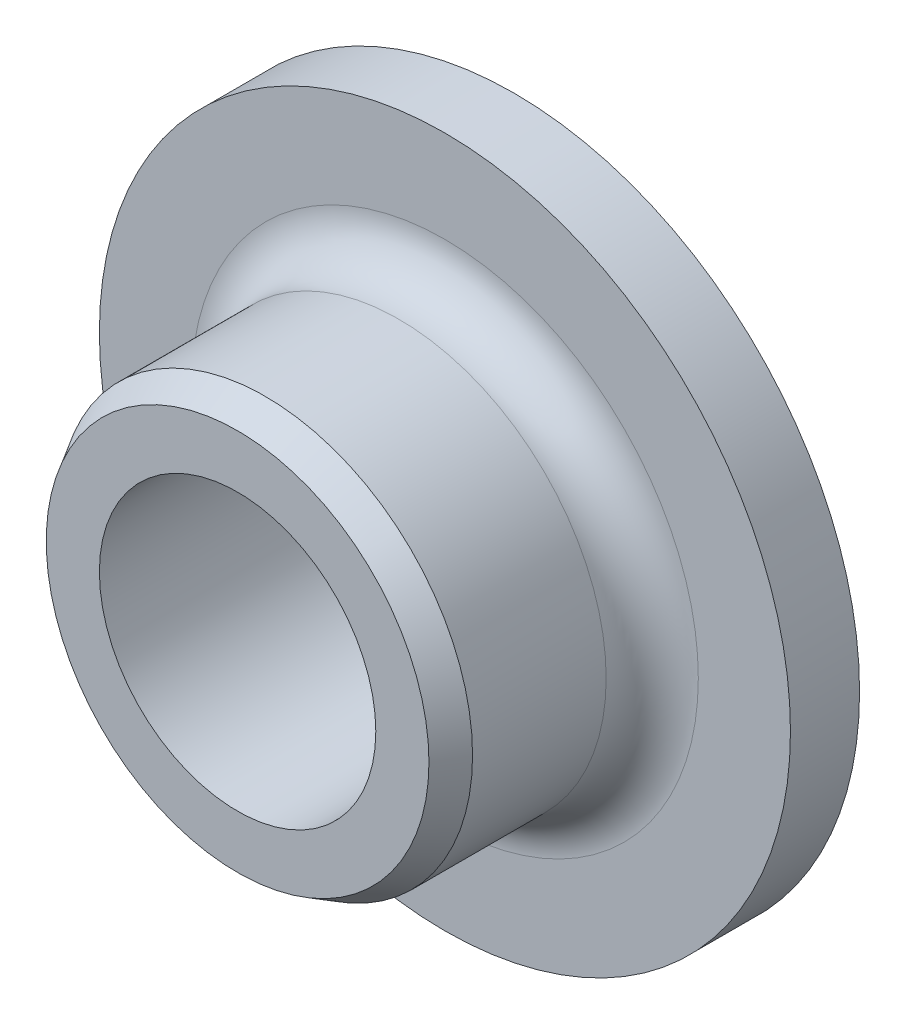
ISO-10303-21;
HEADER;
FILE_DESCRIPTION(('STEP AP214'),'2;1');
FILE_NAME('part.step','',(''),(''),'','','');
FILE_SCHEMA(('AUTOMOTIVE_DESIGN { 1 0 10303 214 1 1 1 1 }'));
ENDSEC;
DATA;
#1=APPLICATION_CONTEXT('core data for automotive mechanical design processes');
#2=APPLICATION_PROTOCOL_DEFINITION('international standard','automotive_design',2000,#1);
#3=PRODUCT_CONTEXT('',#1,'mechanical');
#4=PRODUCT('Part','Part','',(#3));
#5=PRODUCT_RELATED_PRODUCT_CATEGORY('part','',(#4));
#6=PRODUCT_DEFINITION_FORMATION('','',#4);
#7=PRODUCT_DEFINITION_CONTEXT('part definition',#1,'design');
#8=PRODUCT_DEFINITION('design','',#6,#7);
#9=PRODUCT_DEFINITION_SHAPE('','',#8);
#10=(LENGTH_UNIT() NAMED_UNIT(*) SI_UNIT(.MILLI.,.METRE.));
#11=(NAMED_UNIT(*) PLANE_ANGLE_UNIT() SI_UNIT($,.RADIAN.));
#12=(NAMED_UNIT(*) SI_UNIT($,.STERADIAN.) SOLID_ANGLE_UNIT());
#13=UNCERTAINTY_MEASURE_WITH_UNIT(LENGTH_MEASURE(1.E-05),#10,'distance_accuracy_value','');
#14=(GEOMETRIC_REPRESENTATION_CONTEXT(3) GLOBAL_UNCERTAINTY_ASSIGNED_CONTEXT((#13)) GLOBAL_UNIT_ASSIGNED_CONTEXT((#10,
#11,#12)) REPRESENTATION_CONTEXT('',''));
#15=CARTESIAN_POINT('',(0.,0.,0.));
#16=DIRECTION('',(0.,0.,1.));
#17=DIRECTION('',(1.,0.,0.));
#18=AXIS2_PLACEMENT_3D('',#15,#16,#17);
#19=CARTESIAN_POINT('',(0.,0.,1.5));
#20=DIRECTION('',(0.,0.,1.));
#21=DIRECTION('',(-1.,0.,0.));
#22=AXIS2_PLACEMENT_3D('',#19,#20,#21);
#23=CYLINDRICAL_SURFACE('',#22,1.5);
#24=CARTESIAN_POINT('',(0.,0.,0.));
#25=DIRECTION('',(0.,0.,-1.));
#26=DIRECTION('',(1.,0.,0.));
#27=AXIS2_PLACEMENT_3D('',#24,#25,#26);
#28=CIRCLE('',#27,1.5);
#29=CARTESIAN_POINT('',(1.5,0.,0.));
#30=VERTEX_POINT('',#29);
#31=EDGE_CURVE('E55',#30,#30,#28,.F.);
#32=ORIENTED_EDGE('',*,*,#31,.F.);
#33=EDGE_LOOP('',(#32));
#34=FACE_BOUND('',#33,.T.);
#35=CARTESIAN_POINT('',(0.,0.,3.));
#36=DIRECTION('',(0.,0.,1.));
#37=DIRECTION('',(-1.,0.,0.));
#38=AXIS2_PLACEMENT_3D('',#35,#36,#37);
#39=CIRCLE('',#38,1.5);
#40=CARTESIAN_POINT('',(-1.5,0.,3.));
#41=VERTEX_POINT('',#40);
#42=EDGE_CURVE('E51',#41,#41,#39,.T.);
#43=ORIENTED_EDGE('',*,*,#42,.T.);
#44=EDGE_LOOP('',(#43));
#45=FACE_BOUND('',#44,.T.);
#46=ADVANCED_FACE('F17',(#34,#45),#23,.F.);
#47=CARTESIAN_POINT('',(3.75,-3.850334057062,0.));
#48=DIRECTION('',(0.,0.,-1.));
#49=DIRECTION('',(-1.,0.,0.));
#50=AXIS2_PLACEMENT_3D('',#47,#48,#49);
#51=PLANE('',#50);
#52=CARTESIAN_POINT('',(0.,0.,0.));
#53=DIRECTION('',(0.,0.,-1.));
#54=DIRECTION('',(-1.,0.,0.));
#55=AXIS2_PLACEMENT_3D('',#52,#53,#54);
#56=CIRCLE('',#55,3.75);
#57=CARTESIAN_POINT('',(-3.75,0.,0.));
#58=VERTEX_POINT('',#57);
#59=EDGE_CURVE('E47',#58,#58,#56,.F.);
#60=ORIENTED_EDGE('',*,*,#59,.F.);
#61=EDGE_LOOP('',(#60));
#62=FACE_BOUND('',#61,.T.);
#63=ORIENTED_EDGE('',*,*,#31,.T.);
#64=EDGE_LOOP('',(#63));
#65=FACE_BOUND('',#64,.T.);
#66=ADVANCED_FACE('F59',(#62,#65),#51,.T.);
#67=CARTESIAN_POINT('',(-2.0767949192,-2.132361121848,3.));
#68=DIRECTION('',(0.,0.,1.));
#69=DIRECTION('',(1.,0.,0.));
#70=AXIS2_PLACEMENT_3D('',#67,#68,#69);
#71=PLANE('',#70);
#72=CARTESIAN_POINT('',(0.,0.,3.));
#73=DIRECTION('',(0.,0.,1.));
#74=DIRECTION('',(1.,0.,0.));
#75=AXIS2_PLACEMENT_3D('',#72,#73,#74);
#76=CIRCLE('',#75,2.0767949192);
#77=CARTESIAN_POINT('',(2.0767949192,0.,3.));
#78=VERTEX_POINT('',#77);
#79=EDGE_CURVE('E43',#78,#78,#76,.T.);
#80=ORIENTED_EDGE('',*,*,#79,.T.);
#81=EDGE_LOOP('',(#80));
#82=FACE_BOUND('',#81,.T.);
#83=ORIENTED_EDGE('',*,*,#42,.F.);
#84=EDGE_LOOP('',(#83));
#85=FACE_BOUND('',#84,.T.);
#86=ADVANCED_FACE('F66',(#82,#85),#71,.T.);
#87=CARTESIAN_POINT('',(0.,0.,0.375));
#88=DIRECTION('',(0.,0.,1.));
#89=DIRECTION('',(1.,0.,0.));
#90=AXIS2_PLACEMENT_3D('',#87,#88,#89);
#91=CYLINDRICAL_SURFACE('',#90,3.75);
#92=ORIENTED_EDGE('',*,*,#59,.T.);
#93=EDGE_LOOP('',(#92));
#94=FACE_BOUND('',#93,.T.);
#95=CARTESIAN_POINT('',(0.,0.,0.75));
#96=DIRECTION('',(0.,0.,-1.));
#97=DIRECTION('',(-1.,0.,0.));
#98=AXIS2_PLACEMENT_3D('',#95,#96,#97);
#99=CIRCLE('',#98,3.75);
#100=CARTESIAN_POINT('',(-3.75,0.,0.75));
#101=VERTEX_POINT('',#100);
#102=EDGE_CURVE('E38',#101,#101,#99,.F.);
#103=ORIENTED_EDGE('',*,*,#102,.F.);
#104=EDGE_LOOP('',(#103));
#105=FACE_BOUND('',#104,.T.);
#106=ADVANCED_FACE('F68',(#94,#105),#91,.T.);
#107=CARTESIAN_POINT('',(0.,0.,2.7));
#108=DIRECTION('',(0.,0.,-1.));
#109=DIRECTION('',(-1.,0.,0.));
#110=AXIS2_PLACEMENT_3D('',#107,#108,#109);
#111=CONICAL_SURFACE('',#110,2.25,0.523598775706079);
#112=CARTESIAN_POINT('',(0.,0.,2.7));
#113=DIRECTION('',(0.,0.,1.));
#114=DIRECTION('',(1.,0.,0.));
#115=AXIS2_PLACEMENT_3D('',#112,#113,#114);
#116=CIRCLE('',#115,2.25);
#117=CARTESIAN_POINT('',(2.25,0.,2.7));
#118=VERTEX_POINT('',#117);
#119=EDGE_CURVE('E32',#118,#118,#116,.T.);
#120=ORIENTED_EDGE('',*,*,#119,.T.);
#121=EDGE_LOOP('',(#120));
#122=FACE_BOUND('',#121,.T.);
#123=ORIENTED_EDGE('',*,*,#79,.F.);
#124=EDGE_LOOP('',(#123));
#125=FACE_BOUND('',#124,.T.);
#126=ADVANCED_FACE('F76',(#122,#125),#111,.T.);
#127=CARTESIAN_POINT('',(-3.75,-3.850334057062,0.75));
#128=DIRECTION('',(0.,0.,1.));
#129=DIRECTION('',(1.,0.,0.));
#130=AXIS2_PLACEMENT_3D('',#127,#128,#129);
#131=PLANE('',#130);
#132=ORIENTED_EDGE('',*,*,#102,.T.);
#133=EDGE_LOOP('',(#132));
#134=FACE_BOUND('',#133,.T.);
#135=CARTESIAN_POINT('',(0.,0.,0.75));
#136=DIRECTION('',(0.,0.,-1.));
#137=DIRECTION('',(-1.,0.,0.));
#138=AXIS2_PLACEMENT_3D('',#135,#136,#137);
#139=CIRCLE('',#138,2.75);
#140=CARTESIAN_POINT('',(-2.75,0.,0.75));
#141=VERTEX_POINT('',#140);
#142=EDGE_CURVE('E25',#141,#141,#139,.F.);
#143=ORIENTED_EDGE('',*,*,#142,.F.);
#144=EDGE_LOOP('',(#143));
#145=FACE_BOUND('',#144,.T.);
#146=ADVANCED_FACE('F84',(#134,#145),#131,.T.);
#147=CARTESIAN_POINT('',(0.,0.,1.975));
#148=DIRECTION('',(0.,0.,1.));
#149=DIRECTION('',(1.,0.,0.));
#150=AXIS2_PLACEMENT_3D('',#147,#148,#149);
#151=CYLINDRICAL_SURFACE('',#150,2.25);
#152=CARTESIAN_POINT('',(0.,0.,1.25));
#153=DIRECTION('',(0.,0.,1.));
#154=DIRECTION('',(1.,0.,0.));
#155=AXIS2_PLACEMENT_3D('',#152,#153,#154);
#156=CIRCLE('',#155,2.25);
#157=CARTESIAN_POINT('',(2.25,0.,1.25));
#158=VERTEX_POINT('',#157);
#159=EDGE_CURVE('E10',#158,#158,#156,.T.);
#160=ORIENTED_EDGE('',*,*,#159,.T.);
#161=EDGE_LOOP('',(#160));
#162=FACE_BOUND('',#161,.T.);
#163=ORIENTED_EDGE('',*,*,#119,.F.);
#164=EDGE_LOOP('',(#163));
#165=FACE_BOUND('',#164,.T.);
#166=ADVANCED_FACE('F87',(#162,#165),#151,.T.);
#167=CARTESIAN_POINT('',(0.,0.,1.25));
#168=DIRECTION('',(0.,0.,1.));
#169=DIRECTION('',(1.,0.,0.));
#170=AXIS2_PLACEMENT_3D('',#167,#168,#169);
#171=TOROIDAL_SURFACE('',#170,2.75,0.5);
#172=ORIENTED_EDGE('',*,*,#159,.F.);
#173=EDGE_LOOP('',(#172));
#174=FACE_BOUND('',#173,.T.);
#175=ORIENTED_EDGE('',*,*,#142,.T.);
#176=EDGE_LOOP('',(#175));
#177=FACE_BOUND('',#176,.T.);
#178=ADVANCED_FACE('F19',(#174,#177),#171,.F.);
#179=CLOSED_SHELL('',(#46,#66,#86,#106,#126,#146,#166,#178));
#180=MANIFOLD_SOLID_BREP('B1',#179);
#181=ADVANCED_BREP_SHAPE_REPRESENTATION('',(#18,#180),#14);
#182=SHAPE_DEFINITION_REPRESENTATION(#9,#181);
ENDSEC;
END-ISO-10303-21;
